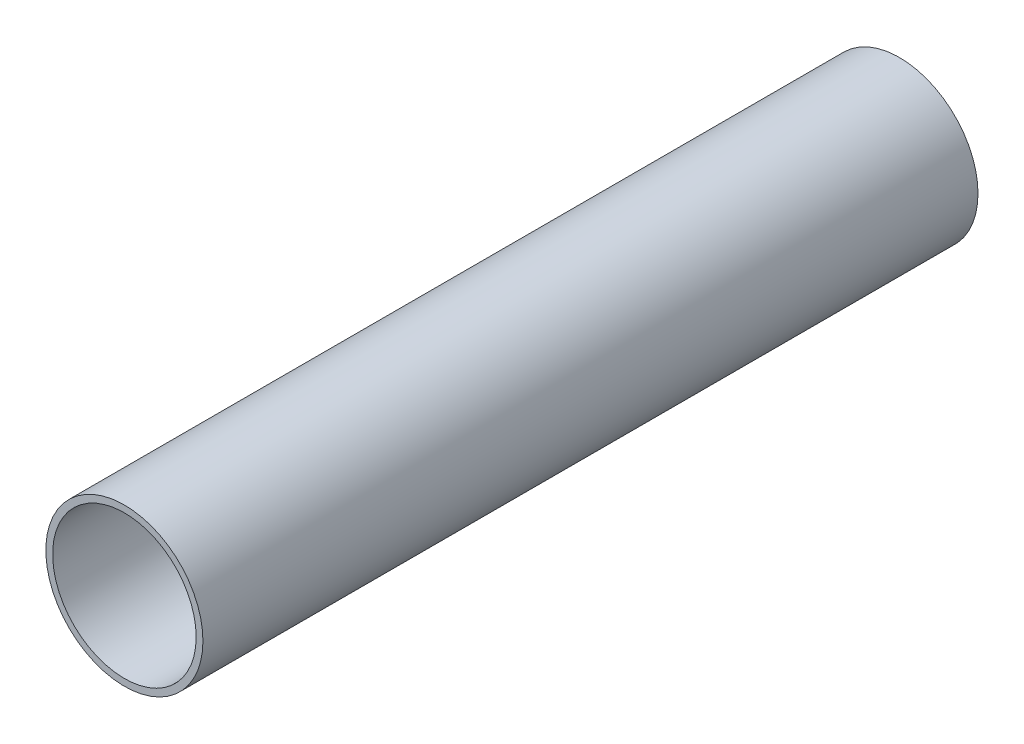
ISO-10303-21;
HEADER;
FILE_DESCRIPTION(('STEP AP214'),'2;1');
FILE_NAME('part.step','',(''),(''),'','','');
FILE_SCHEMA(('AUTOMOTIVE_DESIGN { 1 0 10303 214 1 1 1 1 }'));
ENDSEC;
DATA;
#1=APPLICATION_CONTEXT('core data for automotive mechanical design processes');
#2=APPLICATION_PROTOCOL_DEFINITION('international standard','automotive_design',2000,#1);
#3=PRODUCT_CONTEXT('',#1,'mechanical');
#4=PRODUCT('Part','Part','',(#3));
#5=PRODUCT_RELATED_PRODUCT_CATEGORY('part','',(#4));
#6=PRODUCT_DEFINITION_FORMATION('','',#4);
#7=PRODUCT_DEFINITION_CONTEXT('part definition',#1,'design');
#8=PRODUCT_DEFINITION('design','',#6,#7);
#9=PRODUCT_DEFINITION_SHAPE('','',#8);
#10=(LENGTH_UNIT() NAMED_UNIT(*) SI_UNIT(.MILLI.,.METRE.));
#11=(NAMED_UNIT(*) PLANE_ANGLE_UNIT() SI_UNIT($,.RADIAN.));
#12=(NAMED_UNIT(*) SI_UNIT($,.STERADIAN.) SOLID_ANGLE_UNIT());
#13=UNCERTAINTY_MEASURE_WITH_UNIT(LENGTH_MEASURE(1.E-05),#10,'distance_accuracy_value','');
#14=(GEOMETRIC_REPRESENTATION_CONTEXT(3) GLOBAL_UNCERTAINTY_ASSIGNED_CONTEXT((#13)) GLOBAL_UNIT_ASSIGNED_CONTEXT((#10,
#11,#12)) REPRESENTATION_CONTEXT('',''));
#15=CARTESIAN_POINT('',(0.,0.,0.));
#16=DIRECTION('',(0.,0.,1.));
#17=DIRECTION('',(1.,0.,0.));
#18=AXIS2_PLACEMENT_3D('',#15,#16,#17);
#19=CARTESIAN_POINT('',(0.,0.,85.725));
#20=DIRECTION('',(0.,0.,1.));
#21=DIRECTION('',(1.,0.,0.));
#22=AXIS2_PLACEMENT_3D('',#19,#20,#21);
#23=PLANE('',#22);
#24=CARTESIAN_POINT('',(0.,0.,85.725));
#25=DIRECTION('',(0.,0.,1.));
#26=DIRECTION('',(1.,0.,0.));
#27=AXIS2_PLACEMENT_3D('',#24,#25,#26);
#28=CIRCLE('',#27,17.375);
#29=CARTESIAN_POINT('',(17.375,0.,85.725));
#30=VERTEX_POINT('',#29);
#31=EDGE_CURVE('E10',#30,#30,#28,.T.);
#32=ORIENTED_EDGE('',*,*,#31,.T.);
#33=EDGE_LOOP('',(#32));
#34=FACE_BOUND('',#33,.T.);
#35=CARTESIAN_POINT('',(0.,0.,85.725));
#36=DIRECTION('',(0.,0.,1.));
#37=DIRECTION('',(1.,0.,0.));
#38=AXIS2_PLACEMENT_3D('',#35,#36,#37);
#39=CIRCLE('',#38,15.875);
#40=CARTESIAN_POINT('',(15.875,0.,85.725));
#41=VERTEX_POINT('',#40);
#42=EDGE_CURVE('E56',#41,#41,#39,.T.);
#43=ORIENTED_EDGE('',*,*,#42,.F.);
#44=EDGE_LOOP('',(#43));
#45=FACE_BOUND('',#44,.T.);
#46=ADVANCED_FACE('F43',(#34,#45),#23,.T.);
#47=CARTESIAN_POINT('',(0.,0.,-85.725));
#48=DIRECTION('',(0.,0.,1.));
#49=DIRECTION('',(1.,0.,0.));
#50=AXIS2_PLACEMENT_3D('',#47,#48,#49);
#51=PLANE('',#50);
#52=CARTESIAN_POINT('',(0.,0.,-85.725));
#53=DIRECTION('',(0.,0.,1.));
#54=DIRECTION('',(1.,0.,0.));
#55=AXIS2_PLACEMENT_3D('',#52,#53,#54);
#56=CIRCLE('',#55,17.375);
#57=CARTESIAN_POINT('',(17.375,0.,-85.725));
#58=VERTEX_POINT('',#57);
#59=EDGE_CURVE('E47',#58,#58,#56,.T.);
#60=ORIENTED_EDGE('',*,*,#59,.F.);
#61=EDGE_LOOP('',(#60));
#62=FACE_BOUND('',#61,.T.);
#63=CARTESIAN_POINT('',(0.,0.,-85.725));
#64=DIRECTION('',(0.,0.,1.));
#65=DIRECTION('',(1.,0.,0.));
#66=AXIS2_PLACEMENT_3D('',#63,#64,#65);
#67=CIRCLE('',#66,15.875);
#68=CARTESIAN_POINT('',(15.875,0.,-85.725));
#69=VERTEX_POINT('',#68);
#70=EDGE_CURVE('E58',#69,#69,#67,.T.);
#71=ORIENTED_EDGE('',*,*,#70,.T.);
#72=EDGE_LOOP('',(#71));
#73=FACE_BOUND('',#72,.T.);
#74=ADVANCED_FACE('F70',(#62,#73),#51,.F.);
#75=CARTESIAN_POINT('',(0.,0.,85.725));
#76=DIRECTION('',(0.,0.,-1.));
#77=DIRECTION('',(-1.,0.,0.));
#78=AXIS2_PLACEMENT_3D('',#75,#76,#77);
#79=CYLINDRICAL_SURFACE('',#78,17.375);
#80=ORIENTED_EDGE('',*,*,#31,.F.);
#81=EDGE_LOOP('',(#80));
#82=FACE_BOUND('',#81,.T.);
#83=ORIENTED_EDGE('',*,*,#59,.T.);
#84=EDGE_LOOP('',(#83));
#85=FACE_BOUND('',#84,.T.);
#86=ADVANCED_FACE('F45',(#82,#85),#79,.T.);
#87=CARTESIAN_POINT('',(0.,0.,85.725));
#88=DIRECTION('',(0.,0.,-1.));
#89=DIRECTION('',(-1.,0.,0.));
#90=AXIS2_PLACEMENT_3D('',#87,#88,#89);
#91=CYLINDRICAL_SURFACE('',#90,15.875);
#92=ORIENTED_EDGE('',*,*,#42,.T.);
#93=EDGE_LOOP('',(#92));
#94=FACE_BOUND('',#93,.T.);
#95=ORIENTED_EDGE('',*,*,#70,.F.);
#96=EDGE_LOOP('',(#95));
#97=FACE_BOUND('',#96,.T.);
#98=ADVANCED_FACE('F66',(#94,#97),#91,.F.);
#99=CLOSED_SHELL('',(#46,#74,#86,#98));
#100=MANIFOLD_SOLID_BREP('B2',#99);
#101=ADVANCED_BREP_SHAPE_REPRESENTATION('',(#18,#100),#14);
#102=SHAPE_DEFINITION_REPRESENTATION(#9,#101);
ENDSEC;
END-ISO-10303-21;
